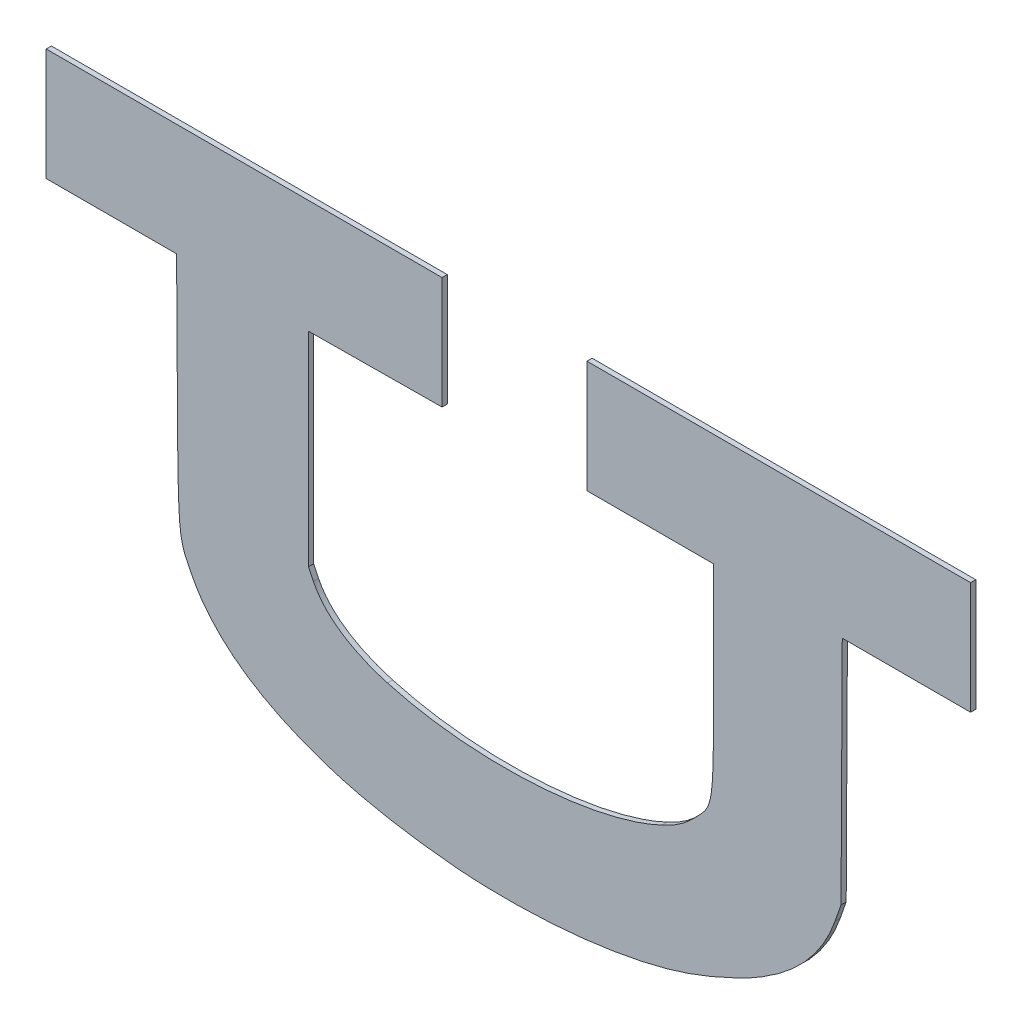
ISO-10303-21;
HEADER;
FILE_DESCRIPTION(('STEP AP214'),'2;1');
FILE_NAME('part.step','',(''),(''),'','','');
FILE_SCHEMA(('AUTOMOTIVE_DESIGN { 1 0 10303 214 1 1 1 1 }'));
ENDSEC;
DATA;
#1=APPLICATION_CONTEXT('core data for automotive mechanical design processes');
#2=APPLICATION_PROTOCOL_DEFINITION('international standard','automotive_design',2000,#1);
#3=PRODUCT_CONTEXT('',#1,'mechanical');
#4=PRODUCT('Part','Part','',(#3));
#5=PRODUCT_RELATED_PRODUCT_CATEGORY('part','',(#4));
#6=PRODUCT_DEFINITION_FORMATION('','',#4);
#7=PRODUCT_DEFINITION_CONTEXT('part definition',#1,'design');
#8=PRODUCT_DEFINITION('design','',#6,#7);
#9=PRODUCT_DEFINITION_SHAPE('','',#8);
#10=(LENGTH_UNIT() NAMED_UNIT(*) SI_UNIT(.MILLI.,.METRE.));
#11=(NAMED_UNIT(*) PLANE_ANGLE_UNIT() SI_UNIT($,.RADIAN.));
#12=(NAMED_UNIT(*) SI_UNIT($,.STERADIAN.) SOLID_ANGLE_UNIT());
#13=UNCERTAINTY_MEASURE_WITH_UNIT(LENGTH_MEASURE(1.E-05),#10,'distance_accuracy_value','');
#14=(GEOMETRIC_REPRESENTATION_CONTEXT(3) GLOBAL_UNCERTAINTY_ASSIGNED_CONTEXT((#13)) GLOBAL_UNIT_ASSIGNED_CONTEXT((#10,
#11,#12)) REPRESENTATION_CONTEXT('',''));
#15=CARTESIAN_POINT('',(0.,0.,0.));
#16=DIRECTION('',(0.,0.,1.));
#17=DIRECTION('',(1.,0.,0.));
#18=AXIS2_PLACEMENT_3D('',#15,#16,#17);
#19=CARTESIAN_POINT('',(-0.3891774209814,-0.131630911380568,0.003));
#20=CARTESIAN_POINT('',(-0.3891774209814,-0.131630911380568,-0.00024));
#21=CARTESIAN_POINT('',(-0.4147421679216,-0.129393168332968,0.003));
#22=CARTESIAN_POINT('',(-0.4147421679216,-0.129393168332968,-0.00024));
#23=CARTESIAN_POINT('',(-0.438749026182,-0.124840020720268,0.003));
#24=CARTESIAN_POINT('',(-0.438749026182,-0.124840020720268,-0.00024));
#25=CARTESIAN_POINT('',(-0.4567901889816,-0.118806779040868,0.003));
#26=CARTESIAN_POINT('',(-0.4567901889816,-0.118806779040868,-0.00024));
#27=B_SPLINE_SURFACE_WITH_KNOTS('',3,1,((#19,#20),(#21,#22),(#23,#24),(#25,#26)),.UNSPECIFIED.,
.F.,.F.,.F.,(4,4),(2,2),(0.,1.),(0.,0.00036),.UNSPECIFIED.);
#28=DIRECTION('',(0.,0.,1.));
#29=VECTOR('',#28,1.);
#30=CARTESIAN_POINT('',(-0.3891774542553,-0.131629746790468,0.0003));
#31=LINE('',#30,#29);
#32=CARTESIAN_POINT('',(-0.389177433699558,-0.13163032942896,0.0003));
#33=VERTEX_POINT('',#32);
#34=CARTESIAN_POINT('',(-0.389177441496779,-0.13163032874638,0.003));
#35=VERTEX_POINT('',#34);
#36=EDGE_CURVE('E11',#33,#35,#31,.T.);
#37=CARTESIAN_POINT('',(-0.3891774209814,-0.131630911380568,0.003));
#38=CARTESIAN_POINT('',(-0.4147421679216,-0.129393168332968,0.003));
#39=CARTESIAN_POINT('',(-0.438749026182,-0.124840020720268,0.003));
#40=CARTESIAN_POINT('',(-0.4567901889816,-0.118806779040868,0.003));
#41=B_SPLINE_CURVE_WITH_KNOTS('',3,(#37,#38,#39,#40),.UNSPECIFIED.,.F.,.F.,(4,4),(0.,1.),.UNSPECIFIED.);
#42=CARTESIAN_POINT('',(-0.4567901889816,-0.118806779040868,0.003));
#43=VERTEX_POINT('',#42);
#44=EDGE_CURVE('E27',#35,#43,#41,.T.);
#45=DIRECTION('',(0.,0.,1.));
#46=VECTOR('',#45,1.);
#47=CARTESIAN_POINT('',(-0.4567901889816,-0.118806779040868,0.0003));
#48=LINE('',#47,#46);
#49=CARTESIAN_POINT('',(-0.4567901889816,-0.118806779040868,0.0003));
#50=VERTEX_POINT('',#49);
#51=EDGE_CURVE('E492',#50,#43,#48,.T.);
#52=CARTESIAN_POINT('',(-0.4567901889816,-0.118806779040868,0.0003));
#53=CARTESIAN_POINT('',(-0.438749026182,-0.124840020720268,0.0003));
#54=CARTESIAN_POINT('',(-0.4147421679216,-0.129393168332968,0.0003));
#55=CARTESIAN_POINT('',(-0.3891774209814,-0.131630911380568,0.0003));
#56=B_SPLINE_CURVE_WITH_KNOTS('',3,(#52,#53,#54,#55),.UNSPECIFIED.,.F.,.F.,(4,4),(0.,1.),.UNSPECIFIED.);
#57=EDGE_CURVE('E512',#33,#50,#56,.F.);
#58=ORIENTED_EDGE('',*,*,#36,.T.);
#59=ORIENTED_EDGE('',*,*,#44,.T.);
#60=ORIENTED_EDGE('',*,*,#51,.F.);
#61=ORIENTED_EDGE('',*,*,#57,.F.);
#62=EDGE_LOOP('',(#58,#59,#60,#61));
#63=FACE_BOUND('',#62,.T.);
#64=ADVANCED_FACE('F17',(#63),#27,.T.);
#65=CARTESIAN_POINT('',(-0.4567901889816,-0.118806779040868,0.003));
#66=CARTESIAN_POINT('',(-0.4567901889816,-0.118806779040868,-0.00024));
#67=CARTESIAN_POINT('',(-0.4916580135813,-0.107146903960468,0.003));
#68=CARTESIAN_POINT('',(-0.4916580135813,-0.107146903960468,-0.00024));
#69=CARTESIAN_POINT('',(-0.5145305611815,-0.09065664230068,0.003));
#70=CARTESIAN_POINT('',(-0.5145305611815,-0.09065664230068,-0.00024));
#71=CARTESIAN_POINT('',(-0.5258803225815,-0.068992273640683,0.003));
#72=CARTESIAN_POINT('',(-0.5258803225815,-0.068992273640683,-0.00024));
#73=B_SPLINE_SURFACE_WITH_KNOTS('',3,1,((#65,#66),(#67,#68),(#69,#70),(#71,#72)),.UNSPECIFIED.,
.F.,.F.,.F.,(4,4),(2,2),(0.,1.),(0.,0.00036),.UNSPECIFIED.);
#74=CARTESIAN_POINT('',(-0.4567901889816,-0.118806779040868,0.003));
#75=CARTESIAN_POINT('',(-0.4916580135813,-0.107146903960468,0.003));
#76=CARTESIAN_POINT('',(-0.5145305611815,-0.09065664230068,0.003));
#77=CARTESIAN_POINT('',(-0.5258803225815,-0.068992273640683,0.003));
#78=B_SPLINE_CURVE_WITH_KNOTS('',3,(#74,#75,#76,#77),.UNSPECIFIED.,.F.,.F.,(4,4),(0.,1.),.UNSPECIFIED.);
#79=CARTESIAN_POINT('',(-0.5258803225815,-0.068992273640683,0.003));
#80=VERTEX_POINT('',#79);
#81=EDGE_CURVE('E489',#43,#80,#78,.T.);
#82=DIRECTION('',(0.,0.,1.));
#83=VECTOR('',#82,1.);
#84=CARTESIAN_POINT('',(-0.5258803225815,-0.068992273640683,0.0003));
#85=LINE('',#84,#83);
#86=CARTESIAN_POINT('',(-0.5258803225815,-0.068992273640683,0.0003));
#87=VERTEX_POINT('',#86);
#88=EDGE_CURVE('E522',#87,#80,#85,.T.);
#89=CARTESIAN_POINT('',(-0.4567901889816,-0.118806779040868,0.0003));
#90=CARTESIAN_POINT('',(-0.4916580135813,-0.107146903960468,0.0003));
#91=CARTESIAN_POINT('',(-0.5145305611815,-0.09065664230068,0.0003));
#92=CARTESIAN_POINT('',(-0.5258803225815,-0.068992273640683,0.0003));
#93=B_SPLINE_CURVE_WITH_KNOTS('',3,(#89,#90,#91,#92),.UNSPECIFIED.,.F.,.F.,(4,4),(0.,1.),.UNSPECIFIED.);
#94=EDGE_CURVE('E517',#50,#87,#93,.T.);
#95=ORIENTED_EDGE('',*,*,#51,.T.);
#96=ORIENTED_EDGE('',*,*,#81,.T.);
#97=ORIENTED_EDGE('',*,*,#88,.F.);
#98=ORIENTED_EDGE('',*,*,#94,.F.);
#99=EDGE_LOOP('',(#95,#96,#97,#98));
#100=FACE_BOUND('',#99,.T.);
#101=ADVANCED_FACE('F520',(#100),#73,.T.);
#102=CARTESIAN_POINT('',(-0.5258803225815,-0.068992273640683,0.003));
#103=CARTESIAN_POINT('',(-0.5258803225815,-0.068992273640683,-0.00024));
#104=CARTESIAN_POINT('',(-0.5333806149219,-0.054674804180683,0.003));
#105=CARTESIAN_POINT('',(-0.5333806149219,-0.054674804180683,-0.00024));
#106=CARTESIAN_POINT('',(-0.5332591648215,-0.055927903020679,0.003));
#107=CARTESIAN_POINT('',(-0.5332591648215,-0.055927903020679,-0.00024));
#108=CARTESIAN_POINT('',(-0.5337086965614,0.01173377775932,0.003));
#109=CARTESIAN_POINT('',(-0.5337086965614,0.01173377775932,-0.00024));
#110=B_SPLINE_SURFACE_WITH_KNOTS('',3,1,((#102,#103),(#104,#105),(#106,#107),(#108,#109)),
.UNSPECIFIED.,.F.,.F.,.F.,(4,4),(2,2),(0.,1.),(0.,0.00036),.UNSPECIFIED.);
#111=CARTESIAN_POINT('',(-0.5258803225815,-0.068992273640683,0.003));
#112=CARTESIAN_POINT('',(-0.5333806149219,-0.054674804180683,0.003));
#113=CARTESIAN_POINT('',(-0.5332591648215,-0.055927903020679,0.003));
#114=CARTESIAN_POINT('',(-0.5337086965614,0.01173377775932,0.003));
#115=B_SPLINE_CURVE_WITH_KNOTS('',3,(#111,#112,#113,#114),.UNSPECIFIED.,.F.,.F.,(4,4),(0.,1.),.UNSPECIFIED.);
#116=CARTESIAN_POINT('',(-0.5337086965614,0.01173377775932,0.003));
#117=VERTEX_POINT('',#116);
#118=EDGE_CURVE('E523',#80,#117,#115,.T.);
#119=DIRECTION('',(0.,0.,1.));
#120=VECTOR('',#119,1.);
#121=CARTESIAN_POINT('',(-0.5337086965614,0.01173377775932,0.0003));
#122=LINE('',#121,#120);
#123=CARTESIAN_POINT('',(-0.5337086965614,0.01173377775932,0.0003));
#124=VERTEX_POINT('',#123);
#125=EDGE_CURVE('E526',#124,#117,#122,.T.);
#126=CARTESIAN_POINT('',(-0.5258803225815,-0.068992273640683,0.0003));
#127=CARTESIAN_POINT('',(-0.5333806149219,-0.054674804180683,0.0003));
#128=CARTESIAN_POINT('',(-0.5332591648215,-0.055927903020679,0.0003));
#129=CARTESIAN_POINT('',(-0.5337086965614,0.01173377775932,0.0003));
#130=B_SPLINE_CURVE_WITH_KNOTS('',3,(#126,#127,#128,#129),.UNSPECIFIED.,.F.,.F.,(4,4),(0.,1.),.UNSPECIFIED.);
#131=EDGE_CURVE('E551',#87,#124,#130,.T.);
#132=ORIENTED_EDGE('',*,*,#88,.T.);
#133=ORIENTED_EDGE('',*,*,#118,.T.);
#134=ORIENTED_EDGE('',*,*,#125,.F.);
#135=ORIENTED_EDGE('',*,*,#131,.F.);
#136=EDGE_LOOP('',(#132,#133,#134,#135));
#137=FACE_BOUND('',#136,.T.);
#138=ADVANCED_FACE('F549',(#137),#110,.T.);
#139=CARTESIAN_POINT('',(-0.5339112187626,0.0422127617593175,0.003));
#140=DIRECTION('',(-0.99997792503977,-0.006644503981185,0.));
#141=DIRECTION('',(0.,0.,1.));
#142=AXIS2_PLACEMENT_3D('',#139,#140,#141);
#143=PLANE('',#142);
#144=ORIENTED_EDGE('',*,*,#125,.T.);
#145=DIRECTION('',(-0.006644503981185,0.99997792503977,0.));
#146=VECTOR('',#145,1.);
#147=CARTESIAN_POINT('',(-0.5337086965614,0.01173377775932,0.003));
#148=LINE('',#147,#146);
#149=CARTESIAN_POINT('',(-0.5341137409638,0.072691745759315,0.003));
#150=VERTEX_POINT('',#149);
#151=EDGE_CURVE('E554',#117,#150,#148,.T.);
#152=ORIENTED_EDGE('',*,*,#151,.T.);
#153=DIRECTION('',(0.,0.,1.));
#154=VECTOR('',#153,1.);
#155=CARTESIAN_POINT('',(-0.5341137409638,0.072691745759315,0.0003));
#156=LINE('',#155,#154);
#157=CARTESIAN_POINT('',(-0.5341137409638,0.072691745759315,0.0003));
#158=VERTEX_POINT('',#157);
#159=EDGE_CURVE('E559',#158,#150,#156,.T.);
#160=ORIENTED_EDGE('',*,*,#159,.F.);
#161=DIRECTION('',(-0.006644503981185,0.99997792503977,0.));
#162=VECTOR('',#161,1.);
#163=CARTESIAN_POINT('',(-0.5337086965614,0.01173377775932,0.0003));
#164=LINE('',#163,#162);
#165=EDGE_CURVE('E562',#124,#158,#164,.T.);
#166=ORIENTED_EDGE('',*,*,#165,.F.);
#167=EDGE_LOOP('',(#144,#152,#160,#166));
#168=FACE_BOUND('',#167,.T.);
#169=ADVANCED_FACE('F577',(#168),#143,.T.);
#170=CARTESIAN_POINT('',(-0.56812309636365,0.072691745759315,0.003));
#171=DIRECTION('',(0.,-1.,0.));
#172=DIRECTION('',(0.,0.,-1.));
#173=AXIS2_PLACEMENT_3D('',#170,#171,#172);
#174=PLANE('',#173);
#175=ORIENTED_EDGE('',*,*,#159,.T.);
#176=DIRECTION('',(-1.,0.,0.));
#177=VECTOR('',#176,1.);
#178=CARTESIAN_POINT('',(-0.5341137409638,0.072691745759315,0.003));
#179=LINE('',#178,#177);
#180=CARTESIAN_POINT('',(-0.6021324517635,0.072691745759315,0.003));
#181=VERTEX_POINT('',#180);
#182=EDGE_CURVE('E556',#150,#181,#179,.T.);
#183=ORIENTED_EDGE('',*,*,#182,.T.);
#184=DIRECTION('',(0.,0.,1.));
#185=VECTOR('',#184,1.);
#186=CARTESIAN_POINT('',(-0.6021324517635,0.072691745759315,0.0003));
#187=LINE('',#186,#185);
#188=CARTESIAN_POINT('',(-0.6021324517635,0.072691745759315,0.0003));
#189=VERTEX_POINT('',#188);
#190=EDGE_CURVE('E587',#189,#181,#187,.T.);
#191=ORIENTED_EDGE('',*,*,#190,.F.);
#192=DIRECTION('',(-1.,0.,0.));
#193=VECTOR('',#192,1.);
#194=CARTESIAN_POINT('',(-0.5341137409638,0.072691745759315,0.0003));
#195=LINE('',#194,#193);
#196=EDGE_CURVE('E582',#158,#189,#195,.T.);
#197=ORIENTED_EDGE('',*,*,#196,.F.);
#198=EDGE_LOOP('',(#175,#183,#191,#197));
#199=FACE_BOUND('',#198,.T.);
#200=ADVANCED_FACE('F585',(#199),#174,.T.);
#201=CARTESIAN_POINT('',(-0.6021324517635,0.101972865759123,0.003));
#202=DIRECTION('',(-1.,0.,0.));
#203=DIRECTION('',(0.,0.,1.));
#204=AXIS2_PLACEMENT_3D('',#201,#202,#203);
#205=PLANE('',#204);
#206=ORIENTED_EDGE('',*,*,#190,.T.);
#207=DIRECTION('',(0.,1.,0.));
#208=VECTOR('',#207,1.);
#209=CARTESIAN_POINT('',(-0.6021324517635,0.072691745759315,0.003));
#210=LINE('',#209,#208);
#211=CARTESIAN_POINT('',(-0.6021324517635,0.131253985758932,0.003));
#212=VERTEX_POINT('',#211);
#213=EDGE_CURVE('E588',#181,#212,#210,.T.);
#214=ORIENTED_EDGE('',*,*,#213,.T.);
#215=DIRECTION('',(0.,0.,1.));
#216=VECTOR('',#215,1.);
#217=CARTESIAN_POINT('',(-0.6021324517635,0.131253985758932,0.0003));
#218=LINE('',#217,#216);
#219=CARTESIAN_POINT('',(-0.6021324517635,0.131253985758932,0.0003));
#220=VERTEX_POINT('',#219);
#221=EDGE_CURVE('E591',#220,#212,#218,.T.);
#222=ORIENTED_EDGE('',*,*,#221,.F.);
#223=DIRECTION('',(0.,1.,0.));
#224=VECTOR('',#223,1.);
#225=CARTESIAN_POINT('',(-0.6021324517635,0.072691745759315,0.0003));
#226=LINE('',#225,#224);
#227=EDGE_CURVE('E598',#189,#220,#226,.T.);
#228=ORIENTED_EDGE('',*,*,#227,.F.);
#229=EDGE_LOOP('',(#206,#214,#222,#228));
#230=FACE_BOUND('',#229,.T.);
#231=ADVANCED_FACE('F596',(#230),#205,.T.);
#232=CARTESIAN_POINT('',(-0.4988499557634,0.131253985758932,0.003));
#233=DIRECTION('',(0.,1.,0.));
#234=DIRECTION('',(0.,0.,1.));
#235=AXIS2_PLACEMENT_3D('',#232,#233,#234);
#236=PLANE('',#235);
#237=ORIENTED_EDGE('',*,*,#221,.T.);
#238=DIRECTION('',(1.,0.,0.));
#239=VECTOR('',#238,1.);
#240=CARTESIAN_POINT('',(-0.6021324517635,0.131253985758932,0.003));
#241=LINE('',#240,#239);
#242=CARTESIAN_POINT('',(-0.3955674597633,0.131253985758932,0.003));
#243=VERTEX_POINT('',#242);
#244=EDGE_CURVE('E601',#212,#243,#241,.T.);
#245=ORIENTED_EDGE('',*,*,#244,.T.);
#246=DIRECTION('',(0.,0.,1.));
#247=VECTOR('',#246,1.);
#248=CARTESIAN_POINT('',(-0.3955674597633,0.131253985758932,0.0003));
#249=LINE('',#248,#247);
#250=CARTESIAN_POINT('',(-0.3955674597633,0.131253985758932,0.0003));
#251=VERTEX_POINT('',#250);
#252=EDGE_CURVE('E606',#251,#243,#249,.T.);
#253=ORIENTED_EDGE('',*,*,#252,.F.);
#254=DIRECTION('',(1.,0.,0.));
#255=VECTOR('',#254,1.);
#256=CARTESIAN_POINT('',(-0.6021324517635,0.131253985758932,0.0003));
#257=LINE('',#256,#255);
#258=EDGE_CURVE('E609',#220,#251,#257,.T.);
#259=ORIENTED_EDGE('',*,*,#258,.F.);
#260=EDGE_LOOP('',(#237,#245,#253,#259));
#261=FACE_BOUND('',#260,.T.);
#262=ADVANCED_FACE('F613',(#261),#236,.T.);
#263=CARTESIAN_POINT('',(-0.3955674597633,0.101987839059123,0.003));
#264=DIRECTION('',(1.,0.,0.));
#265=DIRECTION('',(0.,0.,-1.));
#266=AXIS2_PLACEMENT_3D('',#263,#264,#265);
#267=PLANE('',#266);
#268=ORIENTED_EDGE('',*,*,#252,.T.);
#269=DIRECTION('',(0.,-1.,0.));
#270=VECTOR('',#269,1.);
#271=CARTESIAN_POINT('',(-0.3955674597633,0.131253985758932,0.003));
#272=LINE('',#271,#270);
#273=CARTESIAN_POINT('',(-0.3955674597633,0.072721692359315,0.003));
#274=VERTEX_POINT('',#273);
#275=EDGE_CURVE('E603',#243,#274,#272,.T.);
#276=ORIENTED_EDGE('',*,*,#275,.T.);
#277=DIRECTION('',(0.,0.,1.));
#278=VECTOR('',#277,1.);
#279=CARTESIAN_POINT('',(-0.3955674597633,0.072721692359315,0.0003));
#280=LINE('',#279,#278);
#281=CARTESIAN_POINT('',(-0.3955674597633,0.072721692359315,0.0003));
#282=VERTEX_POINT('',#281);
#283=EDGE_CURVE('E623',#282,#274,#280,.T.);
#284=ORIENTED_EDGE('',*,*,#283,.F.);
#285=DIRECTION('',(0.,-1.,0.));
#286=VECTOR('',#285,1.);
#287=CARTESIAN_POINT('',(-0.3955674597633,0.131253985758932,0.0003));
#288=LINE('',#287,#286);
#289=EDGE_CURVE('E618',#251,#282,#288,.T.);
#290=ORIENTED_EDGE('',*,*,#289,.F.);
#291=EDGE_LOOP('',(#268,#276,#284,#290));
#292=FACE_BOUND('',#291,.T.);
#293=ADVANCED_FACE('F621',(#292),#267,.T.);
#294=CARTESIAN_POINT('',(-0.43043861176335,0.072440942984315,0.003));
#295=DIRECTION('',(0.008050788698891,-0.99996759187552,0.));
#296=DIRECTION('',(0.,0.,-1.));
#297=AXIS2_PLACEMENT_3D('',#294,#295,#296);
#298=PLANE('',#297);
#299=ORIENTED_EDGE('',*,*,#283,.T.);
#300=DIRECTION('',(-0.99996759187552,-0.008050788698891,0.));
#301=VECTOR('',#300,1.);
#302=CARTESIAN_POINT('',(-0.3955674597633,0.072721692359315,0.003));
#303=LINE('',#302,#301);
#304=CARTESIAN_POINT('',(-0.4653097637634,0.072160193609315,0.003));
#305=VERTEX_POINT('',#304);
#306=EDGE_CURVE('E624',#274,#305,#303,.T.);
#307=ORIENTED_EDGE('',*,*,#306,.T.);
#308=DIRECTION('',(0.,0.,1.));
#309=VECTOR('',#308,1.);
#310=CARTESIAN_POINT('',(-0.4653097637634,0.072160193609315,0.0003));
#311=LINE('',#310,#309);
#312=CARTESIAN_POINT('',(-0.4653097637634,0.072160193609315,0.0003));
#313=VERTEX_POINT('',#312);
#314=EDGE_CURVE('E627',#313,#305,#311,.T.);
#315=ORIENTED_EDGE('',*,*,#314,.F.);
#316=DIRECTION('',(-0.99996759187552,-0.008050788698891,0.));
#317=VECTOR('',#316,1.);
#318=CARTESIAN_POINT('',(-0.3955674597633,0.072721692359315,0.0003));
#319=LINE('',#318,#317);
#320=EDGE_CURVE('E634',#282,#313,#319,.T.);
#321=ORIENTED_EDGE('',*,*,#320,.F.);
#322=EDGE_LOOP('',(#299,#307,#315,#321));
#323=FACE_BOUND('',#322,.T.);
#324=ADVANCED_FACE('F632',(#323),#298,.T.);
#325=CARTESIAN_POINT('',(-0.4653097637634,0.0189217936093175,0.003));
#326=DIRECTION('',(1.,0.,0.));
#327=DIRECTION('',(0.,0.,-1.));
#328=AXIS2_PLACEMENT_3D('',#325,#326,#327);
#329=PLANE('',#328);
#330=ORIENTED_EDGE('',*,*,#314,.T.);
#331=DIRECTION('',(0.,-1.,0.));
#332=VECTOR('',#331,1.);
#333=CARTESIAN_POINT('',(-0.4653097637634,0.072160193609315,0.003));
#334=LINE('',#333,#332);
#335=CARTESIAN_POINT('',(-0.4653097637634,-0.03431660639068,0.003));
#336=VERTEX_POINT('',#335);
#337=EDGE_CURVE('E636',#305,#336,#334,.T.);
#338=ORIENTED_EDGE('',*,*,#337,.T.);
#339=DIRECTION('',(0.,0.,1.));
#340=VECTOR('',#339,1.);
#341=CARTESIAN_POINT('',(-0.4653097637634,-0.03431660639068,0.0003));
#342=LINE('',#341,#340);
#343=CARTESIAN_POINT('',(-0.4653097637634,-0.03431660639068,0.0003));
#344=VERTEX_POINT('',#343);
#345=EDGE_CURVE('E640',#344,#336,#342,.T.);
#346=ORIENTED_EDGE('',*,*,#345,.F.);
#347=DIRECTION('',(0.,-1.,0.));
#348=VECTOR('',#347,1.);
#349=CARTESIAN_POINT('',(-0.4653097637634,0.072160193609315,0.0003));
#350=LINE('',#349,#348);
#351=EDGE_CURVE('E643',#313,#344,#350,.T.);
#352=ORIENTED_EDGE('',*,*,#351,.F.);
#353=EDGE_LOOP('',(#330,#338,#346,#352));
#354=FACE_BOUND('',#353,.T.);
#355=ADVANCED_FACE('F647',(#354),#329,.T.);
#356=CARTESIAN_POINT('',(-0.4640085507195,-0.036978526390681,0.003));
#357=DIRECTION('',(0.89840700790208,0.439163805603822,0.));
#358=DIRECTION('',(0.,0.,-1.));
#359=AXIS2_PLACEMENT_3D('',#356,#357,#358);
#360=PLANE('',#359);
#361=ORIENTED_EDGE('',*,*,#345,.T.);
#362=DIRECTION('',(0.439163805603822,-0.89840700790208,0.));
#363=VECTOR('',#362,1.);
#364=CARTESIAN_POINT('',(-0.4653097637634,-0.03431660639068,0.003));
#365=LINE('',#364,#363);
#366=CARTESIAN_POINT('',(-0.4627073376756,-0.039640446390682,0.003));
#367=VERTEX_POINT('',#366);
#368=EDGE_CURVE('E637',#336,#367,#365,.T.);
#369=ORIENTED_EDGE('',*,*,#368,.T.);
#370=DIRECTION('',(0.,0.,1.));
#371=VECTOR('',#370,1.);
#372=CARTESIAN_POINT('',(-0.4627073376756,-0.039640446390682,0.0003));
#373=LINE('',#372,#371);
#374=CARTESIAN_POINT('',(-0.4627073376756,-0.039640446390682,0.0003));
#375=VERTEX_POINT('',#374);
#376=EDGE_CURVE('E653',#375,#367,#373,.T.);
#377=ORIENTED_EDGE('',*,*,#376,.F.);
#378=DIRECTION('',(0.439163805603822,-0.89840700790208,0.));
#379=VECTOR('',#378,1.);
#380=CARTESIAN_POINT('',(-0.4653097637634,-0.03431660639068,0.0003));
#381=LINE('',#380,#379);
#382=EDGE_CURVE('E650',#344,#375,#381,.T.);
#383=ORIENTED_EDGE('',*,*,#382,.F.);
#384=EDGE_LOOP('',(#361,#369,#377,#383));
#385=FACE_BOUND('',#384,.T.);
#386=ADVANCED_FACE('F297',(#385),#360,.T.);
#387=CARTESIAN_POINT('',(-0.4627073376756,-0.039640446390682,0.003));
#388=CARTESIAN_POINT('',(-0.4627073376756,-0.039640446390682,-0.00024));
#389=CARTESIAN_POINT('',(-0.456956259516,-0.051405800050684,0.003));
#390=CARTESIAN_POINT('',(-0.456956259516,-0.051405800050684,-0.00024));
#391=CARTESIAN_POINT('',(-0.4434626542959,-0.060674605490683,0.003));
#392=CARTESIAN_POINT('',(-0.4434626542959,-0.060674605490683,-0.00024));
#393=CARTESIAN_POINT('',(-0.4240362948759,-0.066205077030685,0.003));
#394=CARTESIAN_POINT('',(-0.4240362948759,-0.066205077030685,-0.00024));
#395=B_SPLINE_SURFACE_WITH_KNOTS('',3,1,((#387,#388),(#389,#390),(#391,#392),(#393,#394)),
.UNSPECIFIED.,.F.,.F.,.F.,(4,4),(2,2),(0.,1.),(0.,0.00036),.UNSPECIFIED.);
#396=CARTESIAN_POINT('',(-0.4627073376756,-0.039640446390682,0.003));
#397=CARTESIAN_POINT('',(-0.456956259516,-0.051405800050684,0.003));
#398=CARTESIAN_POINT('',(-0.4434626542959,-0.060674605490683,0.003));
#399=CARTESIAN_POINT('',(-0.4240362948759,-0.066205077030685,0.003));
#400=B_SPLINE_CURVE_WITH_KNOTS('',3,(#396,#397,#398,#399),.UNSPECIFIED.,.F.,.F.,(4,4),(0.,1.),.UNSPECIFIED.);
#401=CARTESIAN_POINT('',(-0.4240362948759,-0.066205077030685,0.003));
#402=VERTEX_POINT('',#401);
#403=EDGE_CURVE('E265',#367,#402,#400,.T.);
#404=DIRECTION('',(0.,0.,1.));
#405=VECTOR('',#404,1.);
#406=CARTESIAN_POINT('',(-0.4240362948759,-0.066205077030685,0.0003));
#407=LINE('',#406,#405);
#408=CARTESIAN_POINT('',(-0.4240362948759,-0.066205077030685,0.0003));
#409=VERTEX_POINT('',#408);
#410=EDGE_CURVE('E262',#409,#402,#407,.T.);
#411=CARTESIAN_POINT('',(-0.4240362948759,-0.066205077030685,0.0003));
#412=CARTESIAN_POINT('',(-0.4434626542959,-0.060674605490683,0.0003));
#413=CARTESIAN_POINT('',(-0.456956259516,-0.051405800050684,0.0003));
#414=CARTESIAN_POINT('',(-0.4627073376756,-0.039640446390682,0.0003));
#415=B_SPLINE_CURVE_WITH_KNOTS('',3,(#411,#412,#413,#414),.UNSPECIFIED.,.F.,.F.,(4,4),(0.,1.),.UNSPECIFIED.);
#416=EDGE_CURVE('E258',#375,#409,#415,.F.);
#417=ORIENTED_EDGE('',*,*,#376,.T.);
#418=ORIENTED_EDGE('',*,*,#403,.T.);
#419=ORIENTED_EDGE('',*,*,#410,.F.);
#420=ORIENTED_EDGE('',*,*,#416,.F.);
#421=EDGE_LOOP('',(#417,#418,#419,#420));
#422=FACE_BOUND('',#421,.T.);
#423=ADVANCED_FACE('F284',(#422),#395,.T.);
#424=CARTESIAN_POINT('',(-0.4240362948759,-0.066205077030685,0.003));
#425=CARTESIAN_POINT('',(-0.4240362948759,-0.066205077030685,-0.00024));
#426=CARTESIAN_POINT('',(-0.3793093840755,-0.078936707650681,0.003));
#427=CARTESIAN_POINT('',(-0.3793093840755,-0.078936707650681,-0.00024));
#428=CARTESIAN_POINT('',(-0.3164614528761,-0.075689497990684,0.003));
#429=CARTESIAN_POINT('',(-0.3164614528761,-0.075689497990684,-0.00024));
#430=CARTESIAN_POINT('',(-0.2808183440754,-0.058805937650683,0.003));
#431=CARTESIAN_POINT('',(-0.2808183440754,-0.058805937650683,-0.00024));
#432=B_SPLINE_SURFACE_WITH_KNOTS('',3,1,((#424,#425),(#426,#427),(#428,#429),(#430,#431)),
.UNSPECIFIED.,.F.,.F.,.F.,(4,4),(2,2),(0.,1.),(0.,0.00036),.UNSPECIFIED.);
#433=CARTESIAN_POINT('',(-0.4240362948759,-0.066205077030685,0.003));
#434=CARTESIAN_POINT('',(-0.3793093840755,-0.078936707650681,0.003));
#435=CARTESIAN_POINT('',(-0.3164614528761,-0.075689497990684,0.003));
#436=CARTESIAN_POINT('',(-0.2808183440754,-0.058805937650683,0.003));
#437=B_SPLINE_CURVE_WITH_KNOTS('',3,(#433,#434,#435,#436),.UNSPECIFIED.,.F.,.F.,(4,4),(0.,
0.015507645560473),.UNSPECIFIED.);
#438=CARTESIAN_POINT('',(-0.2808183440754,-0.058805937650683,0.003));
#439=VERTEX_POINT('',#438);
#440=EDGE_CURVE('E312',#402,#439,#437,.T.);
#441=DIRECTION('',(0.,0.,1.));
#442=VECTOR('',#441,1.);
#443=CARTESIAN_POINT('',(-0.2808183440754,-0.058805937650683,0.0003));
#444=LINE('',#443,#442);
#445=CARTESIAN_POINT('',(-0.2808183440754,-0.058805937650683,0.0003));
#446=VERTEX_POINT('',#445);
#447=EDGE_CURVE('E319',#446,#439,#444,.T.);
#448=CARTESIAN_POINT('',(-0.4240362948759,-0.066205077030685,0.0003));
#449=CARTESIAN_POINT('',(-0.3793093840755,-0.078936707650681,0.0003));
#450=CARTESIAN_POINT('',(-0.3164614528761,-0.075689497990684,0.0003));
#451=CARTESIAN_POINT('',(-0.2808183440754,-0.058805937650683,0.0003));
#452=B_SPLINE_CURVE_WITH_KNOTS('',3,(#448,#449,#450,#451),.UNSPECIFIED.,.F.,.F.,(4,4),(0.,
0.015507645560473),.UNSPECIFIED.);
#453=EDGE_CURVE('E329',#409,#446,#452,.T.);
#454=ORIENTED_EDGE('',*,*,#410,.T.);
#455=ORIENTED_EDGE('',*,*,#440,.T.);
#456=ORIENTED_EDGE('',*,*,#447,.F.);
#457=ORIENTED_EDGE('',*,*,#453,.F.);
#458=EDGE_LOOP('',(#454,#455,#456,#457));
#459=FACE_BOUND('',#458,.T.);
#460=ADVANCED_FACE('F296',(#459),#432,.T.);
#461=CARTESIAN_POINT('',(-0.2808183440754,-0.058805937650683,0.003));
#462=CARTESIAN_POINT('',(-0.2808183440754,-0.058805937650683,-0.00024));
#463=CARTESIAN_POINT('',(-0.2731779681957,-0.055186724670679,0.003));
#464=CARTESIAN_POINT('',(-0.2731779681957,-0.055186724670679,-0.00024));
#465=CARTESIAN_POINT('',(-0.2693042091153,-0.052526801110681,0.003));
#466=CARTESIAN_POINT('',(-0.2693042091153,-0.052526801110681,-0.00024));
#467=CARTESIAN_POINT('',(-0.2641101377157,-0.047332729710685,0.003));
#468=CARTESIAN_POINT('',(-0.2641101377157,-0.047332729710685,-0.00024));
#469=B_SPLINE_SURFACE_WITH_KNOTS('',3,1,((#461,#462),(#463,#464),(#465,#466),(#467,#468)),
.UNSPECIFIED.,.F.,.F.,.F.,(4,4),(2,2),(0.,1.),(0.,0.00036),.UNSPECIFIED.);
#470=CARTESIAN_POINT('',(-0.2808183440754,-0.058805937650683,0.003));
#471=CARTESIAN_POINT('',(-0.2731779681957,-0.055186724670679,0.003));
#472=CARTESIAN_POINT('',(-0.2693042091153,-0.052526801110681,0.003));
#473=CARTESIAN_POINT('',(-0.2641101377157,-0.047332729710685,0.003));
#474=B_SPLINE_CURVE_WITH_KNOTS('',3,(#470,#471,#472,#473),.UNSPECIFIED.,.F.,.F.,(4,4),(0.,1.),.UNSPECIFIED.);
#475=CARTESIAN_POINT('',(-0.2641101377157,-0.047332729710685,0.003));
#476=VERTEX_POINT('',#475);
#477=EDGE_CURVE('E331',#439,#476,#474,.T.);
#478=DIRECTION('',(0.,0.,1.));
#479=VECTOR('',#478,1.);
#480=CARTESIAN_POINT('',(-0.2641101377157,-0.047332729710685,0.0003));
#481=LINE('',#480,#479);
#482=CARTESIAN_POINT('',(-0.2641101377157,-0.047332729710685,0.0003));
#483=VERTEX_POINT('',#482);
#484=EDGE_CURVE('E342',#483,#476,#481,.T.);
#485=CARTESIAN_POINT('',(-0.2808183440754,-0.058805937650683,0.0003));
#486=CARTESIAN_POINT('',(-0.2731779681957,-0.055186724670679,0.0003));
#487=CARTESIAN_POINT('',(-0.2693042091153,-0.052526801110681,0.0003));
#488=CARTESIAN_POINT('',(-0.2641101377157,-0.047332729710685,0.0003));
#489=B_SPLINE_CURVE_WITH_KNOTS('',3,(#485,#486,#487,#488),.UNSPECIFIED.,.F.,.F.,(4,4),(0.,1.),.UNSPECIFIED.);
#490=EDGE_CURVE('E348',#446,#483,#489,.T.);
#491=ORIENTED_EDGE('',*,*,#447,.T.);
#492=ORIENTED_EDGE('',*,*,#477,.T.);
#493=ORIENTED_EDGE('',*,*,#484,.F.);
#494=ORIENTED_EDGE('',*,*,#490,.F.);
#495=EDGE_LOOP('',(#491,#492,#493,#494));
#496=FACE_BOUND('',#495,.T.);
#497=ADVANCED_FACE('F667',(#496),#469,.T.);
#498=CARTESIAN_POINT('',(-0.2641101377157,-0.047332729710685,0.003));
#499=CARTESIAN_POINT('',(-0.2641101377157,-0.047332729710685,-0.00024));
#500=CARTESIAN_POINT('',(-0.2536880554359,-0.036910647430687,0.003));
#501=CARTESIAN_POINT('',(-0.2536880554359,-0.036910647430687,-0.00024));
#502=CARTESIAN_POINT('',(-0.2539535819553,-0.038717092890685,0.003));
#503=CARTESIAN_POINT('',(-0.2539535819553,-0.038717092890685,-0.00024));
#504=CARTESIAN_POINT('',(-0.2539535819553,0.021777368289317,0.003));
#505=CARTESIAN_POINT('',(-0.2539535819553,0.021777368289317,-0.00024));
#506=B_SPLINE_SURFACE_WITH_KNOTS('',3,1,((#498,#499),(#500,#501),(#502,#503),(#504,#505)),
.UNSPECIFIED.,.F.,.F.,.F.,(4,4),(2,2),(0.,1.),(0.,0.00036),.UNSPECIFIED.);
#507=CARTESIAN_POINT('',(-0.2641101377157,-0.047332729710685,0.003));
#508=CARTESIAN_POINT('',(-0.2536880554359,-0.036910647430687,0.003));
#509=CARTESIAN_POINT('',(-0.2539535819553,-0.038717092890685,0.003));
#510=CARTESIAN_POINT('',(-0.2539535819553,0.021777368289317,0.003));
#511=B_SPLINE_CURVE_WITH_KNOTS('',3,(#507,#508,#509,#510),.UNSPECIFIED.,.F.,.F.,(4,4),(0.,1.),.UNSPECIFIED.);
#512=CARTESIAN_POINT('',(-0.2539535819553,0.021777368289317,0.003));
#513=VERTEX_POINT('',#512);
#514=EDGE_CURVE('E353',#476,#513,#511,.T.);
#515=DIRECTION('',(0.,0.,1.));
#516=VECTOR('',#515,1.);
#517=CARTESIAN_POINT('',(-0.2539535819553,0.021777368289317,0.0003));
#518=LINE('',#517,#516);
#519=CARTESIAN_POINT('',(-0.2539535819553,0.021777368289317,0.0003));
#520=VERTEX_POINT('',#519);
#521=EDGE_CURVE('E360',#520,#513,#518,.T.);
#522=CARTESIAN_POINT('',(-0.2641101377157,-0.047332729710685,0.0003));
#523=CARTESIAN_POINT('',(-0.2536880554359,-0.036910647430687,0.0003));
#524=CARTESIAN_POINT('',(-0.2539535819553,-0.038717092890685,0.0003));
#525=CARTESIAN_POINT('',(-0.2539535819553,0.021777368289317,0.0003));
#526=B_SPLINE_CURVE_WITH_KNOTS('',3,(#522,#523,#524,#525),.UNSPECIFIED.,.F.,.F.,(4,4),(0.,1.),.UNSPECIFIED.);
#527=EDGE_CURVE('E366',#483,#520,#526,.T.);
#528=ORIENTED_EDGE('',*,*,#484,.T.);
#529=ORIENTED_EDGE('',*,*,#514,.T.);
#530=ORIENTED_EDGE('',*,*,#521,.F.);
#531=ORIENTED_EDGE('',*,*,#527,.F.);
#532=EDGE_LOOP('',(#528,#529,#530,#531));
#533=FACE_BOUND('',#532,.T.);
#534=ADVANCED_FACE('F671',(#533),#506,.T.);
#535=CARTESIAN_POINT('',(-0.2539535819553,0.047235305689316,0.003));
#536=DIRECTION('',(-1.,0.,0.));
#537=DIRECTION('',(0.,0.,1.));
#538=AXIS2_PLACEMENT_3D('',#535,#536,#537);
#539=PLANE('',#538);
#540=ORIENTED_EDGE('',*,*,#521,.T.);
#541=DIRECTION('',(0.,1.,0.));
#542=VECTOR('',#541,1.);
#543=CARTESIAN_POINT('',(-0.2539535819553,0.021777368289317,0.003));
#544=LINE('',#543,#542);
#545=CARTESIAN_POINT('',(-0.2539535819553,0.072693243089315,0.003));
#546=VERTEX_POINT('',#545);
#547=EDGE_CURVE('E371',#513,#546,#544,.T.);
#548=ORIENTED_EDGE('',*,*,#547,.T.);
#549=DIRECTION('',(0.,0.,1.));
#550=VECTOR('',#549,1.);
#551=CARTESIAN_POINT('',(-0.2539535819553,0.072693243089315,0.0003));
#552=LINE('',#551,#550);
#553=CARTESIAN_POINT('',(-0.2539535819553,0.072693243089315,0.0003));
#554=VERTEX_POINT('',#553);
#555=EDGE_CURVE('E376',#554,#546,#552,.T.);
#556=ORIENTED_EDGE('',*,*,#555,.F.);
#557=DIRECTION('',(0.,1.,0.));
#558=VECTOR('',#557,1.);
#559=CARTESIAN_POINT('',(-0.2539535819553,0.021777368289317,0.0003));
#560=LINE('',#559,#558);
#561=EDGE_CURVE('E379',#520,#554,#560,.T.);
#562=ORIENTED_EDGE('',*,*,#561,.F.);
#563=EDGE_LOOP('',(#540,#548,#556,#562));
#564=FACE_BOUND('',#563,.T.);
#565=ADVANCED_FACE('F675',(#564),#539,.T.);
#566=CARTESIAN_POINT('',(-0.28696138995555,0.072693243089315,0.003));
#567=DIRECTION('',(0.,-1.,0.));
#568=DIRECTION('',(0.,0.,-1.));
#569=AXIS2_PLACEMENT_3D('',#566,#567,#568);
#570=PLANE('',#569);
#571=ORIENTED_EDGE('',*,*,#555,.T.);
#572=DIRECTION('',(-1.,0.,0.));
#573=VECTOR('',#572,1.);
#574=CARTESIAN_POINT('',(-0.2539535819553,0.072693243089315,0.003));
#575=LINE('',#574,#573);
#576=CARTESIAN_POINT('',(-0.3199691979558,0.072693243089315,0.003));
#577=VERTEX_POINT('',#576);
#578=EDGE_CURVE('E382',#546,#577,#575,.T.);
#579=ORIENTED_EDGE('',*,*,#578,.T.);
#580=DIRECTION('',(0.,0.,1.));
#581=VECTOR('',#580,1.);
#582=CARTESIAN_POINT('',(-0.3199691979558,0.072693243089315,0.0003));
#583=LINE('',#582,#581);
#584=CARTESIAN_POINT('',(-0.3199691979558,0.072693243089315,0.0003));
#585=VERTEX_POINT('',#584);
#586=EDGE_CURVE('E384',#585,#577,#583,.T.);
#587=ORIENTED_EDGE('',*,*,#586,.F.);
#588=DIRECTION('',(-1.,0.,0.));
#589=VECTOR('',#588,1.);
#590=CARTESIAN_POINT('',(-0.2539535819553,0.072693243089315,0.0003));
#591=LINE('',#590,#589);
#592=EDGE_CURVE('E387',#554,#585,#591,.T.);
#593=ORIENTED_EDGE('',*,*,#592,.F.);
#594=EDGE_LOOP('',(#571,#579,#587,#593));
#595=FACE_BOUND('',#594,.T.);
#596=ADVANCED_FACE('F678',(#595),#570,.T.);
#597=CARTESIAN_POINT('',(-0.3199691979558,0.101974363089123,0.003));
#598=DIRECTION('',(-1.,0.,0.));
#599=DIRECTION('',(0.,0.,1.));
#600=AXIS2_PLACEMENT_3D('',#597,#598,#599);
#601=PLANE('',#600);
#602=ORIENTED_EDGE('',*,*,#586,.T.);
#603=DIRECTION('',(0.,1.,0.));
#604=VECTOR('',#603,1.);
#605=CARTESIAN_POINT('',(-0.3199691979558,0.072693243089315,0.003));
#606=LINE('',#605,#604);
#607=CARTESIAN_POINT('',(-0.3199691979558,0.131255483088932,0.003));
#608=VERTEX_POINT('',#607);
#609=EDGE_CURVE('E390',#577,#608,#606,.T.);
#610=ORIENTED_EDGE('',*,*,#609,.T.);
#611=DIRECTION('',(0.,0.,1.));
#612=VECTOR('',#611,1.);
#613=CARTESIAN_POINT('',(-0.3199691979558,0.131255483088932,0.0003));
#614=LINE('',#613,#612);
#615=CARTESIAN_POINT('',(-0.3199691979558,0.131255483088932,0.0003));
#616=VERTEX_POINT('',#615);
#617=EDGE_CURVE('E392',#616,#608,#614,.T.);
#618=ORIENTED_EDGE('',*,*,#617,.F.);
#619=DIRECTION('',(0.,1.,0.));
#620=VECTOR('',#619,1.);
#621=CARTESIAN_POINT('',(-0.3199691979558,0.072693243089315,0.0003));
#622=LINE('',#621,#620);
#623=EDGE_CURVE('E395',#585,#616,#622,.T.);
#624=ORIENTED_EDGE('',*,*,#623,.F.);
#625=EDGE_LOOP('',(#602,#610,#618,#624));
#626=FACE_BOUND('',#625,.T.);
#627=ADVANCED_FACE('F683',(#626),#601,.T.);
#628=CARTESIAN_POINT('',(-0.219881005955774,0.131255483088932,0.003));
#629=DIRECTION('',(0.,1.,0.));
#630=DIRECTION('',(0.,0.,1.));
#631=AXIS2_PLACEMENT_3D('',#628,#629,#630);
#632=PLANE('',#631);
#633=ORIENTED_EDGE('',*,*,#617,.T.);
#634=DIRECTION('',(1.,0.,0.));
#635=VECTOR('',#634,1.);
#636=CARTESIAN_POINT('',(-0.3199691979558,0.131255483088932,0.003));
#637=LINE('',#636,#635);
#638=CARTESIAN_POINT('',(-0.119792813955748,0.131255483088932,0.003));
#639=VERTEX_POINT('',#638);
#640=EDGE_CURVE('E398',#608,#639,#637,.T.);
#641=ORIENTED_EDGE('',*,*,#640,.T.);
#642=DIRECTION('',(0.,0.,1.));
#643=VECTOR('',#642,1.);
#644=CARTESIAN_POINT('',(-0.119792813955748,0.131255483088932,0.0003));
#645=LINE('',#644,#643);
#646=CARTESIAN_POINT('',(-0.119792813955748,0.131255483088932,0.0003));
#647=VERTEX_POINT('',#646);
#648=EDGE_CURVE('E400',#647,#639,#645,.T.);
#649=ORIENTED_EDGE('',*,*,#648,.F.);
#650=DIRECTION('',(1.,0.,0.));
#651=VECTOR('',#650,1.);
#652=CARTESIAN_POINT('',(-0.3199691979558,0.131255483088932,0.0003));
#653=LINE('',#652,#651);
#654=EDGE_CURVE('E403',#616,#647,#653,.T.);
#655=ORIENTED_EDGE('',*,*,#654,.F.);
#656=EDGE_LOOP('',(#633,#641,#649,#655));
#657=FACE_BOUND('',#656,.T.);
#658=ADVANCED_FACE('F687',(#657),#632,.T.);
#659=CARTESIAN_POINT('',(-0.119792813955748,0.101974363089123,0.003));
#660=DIRECTION('',(1.,0.,0.));
#661=DIRECTION('',(0.,0.,-1.));
#662=AXIS2_PLACEMENT_3D('',#659,#660,#661);
#663=PLANE('',#662);
#664=ORIENTED_EDGE('',*,*,#648,.T.);
#665=DIRECTION('',(0.,-1.,0.));
#666=VECTOR('',#665,1.);
#667=CARTESIAN_POINT('',(-0.119792813955748,0.131255483088932,0.003));
#668=LINE('',#667,#666);
#669=CARTESIAN_POINT('',(-0.119792813955748,0.072693243089315,0.003));
#670=VERTEX_POINT('',#669);
#671=EDGE_CURVE('E406',#639,#670,#668,.T.);
#672=ORIENTED_EDGE('',*,*,#671,.T.);
#673=DIRECTION('',(0.,0.,1.));
#674=VECTOR('',#673,1.);
#675=CARTESIAN_POINT('',(-0.119792813955748,0.072693243089315,0.0003));
#676=LINE('',#675,#674);
#677=CARTESIAN_POINT('',(-0.119792813955748,0.072693243089315,0.0003));
#678=VERTEX_POINT('',#677);
#679=EDGE_CURVE('E408',#678,#670,#676,.T.);
#680=ORIENTED_EDGE('',*,*,#679,.F.);
#681=DIRECTION('',(0.,-1.,0.));
#682=VECTOR('',#681,1.);
#683=CARTESIAN_POINT('',(-0.119792813955748,0.131255483088932,0.0003));
#684=LINE('',#683,#682);
#685=EDGE_CURVE('E411',#647,#678,#684,.T.);
#686=ORIENTED_EDGE('',*,*,#685,.F.);
#687=EDGE_LOOP('',(#664,#672,#680,#686));
#688=FACE_BOUND('',#687,.T.);
#689=ADVANCED_FACE('F691',(#688),#663,.T.);
#690=CARTESIAN_POINT('',(-0.153276440155748,0.072693243089315,0.003));
#691=DIRECTION('',(0.,-1.,0.));
#692=DIRECTION('',(0.,0.,-1.));
#693=AXIS2_PLACEMENT_3D('',#690,#691,#692);
#694=PLANE('',#693);
#695=ORIENTED_EDGE('',*,*,#679,.T.);
#696=DIRECTION('',(-1.,0.,0.));
#697=VECTOR('',#696,1.);
#698=CARTESIAN_POINT('',(-0.119792813955748,0.072693243089315,0.003));
#699=LINE('',#698,#697);
#700=CARTESIAN_POINT('',(-0.186760066355748,0.072693243089315,0.003));
#701=VERTEX_POINT('',#700);
#702=EDGE_CURVE('E414',#670,#701,#699,.T.);
#703=ORIENTED_EDGE('',*,*,#702,.T.);
#704=DIRECTION('',(0.,0.,1.));
#705=VECTOR('',#704,1.);
#706=CARTESIAN_POINT('',(-0.186760066355748,0.072693243089315,0.0003));
#707=LINE('',#706,#705);
#708=CARTESIAN_POINT('',(-0.186760066355748,0.072693243089315,0.0003));
#709=VERTEX_POINT('',#708);
#710=EDGE_CURVE('E416',#709,#701,#707,.T.);
#711=ORIENTED_EDGE('',*,*,#710,.F.);
#712=DIRECTION('',(-1.,0.,0.));
#713=VECTOR('',#712,1.);
#714=CARTESIAN_POINT('',(-0.119792813955748,0.072693243089315,0.0003));
#715=LINE('',#714,#713);
#716=EDGE_CURVE('E419',#678,#709,#715,.T.);
#717=ORIENTED_EDGE('',*,*,#716,.F.);
#718=EDGE_LOOP('',(#695,#703,#711,#717));
#719=FACE_BOUND('',#718,.T.);
#720=ADVANCED_FACE('F694',(#719),#694,.T.);
#721=CARTESIAN_POINT('',(-0.187083822375747,0.0122676590893175,0.003));
#722=DIRECTION('',(0.99998564660469,-0.005357852610922,0.));
#723=DIRECTION('',(0.,0.,-1.));
#724=AXIS2_PLACEMENT_3D('',#721,#722,#723);
#725=PLANE('',#724);
#726=ORIENTED_EDGE('',*,*,#710,.T.);
#727=DIRECTION('',(-0.005357852610922,-0.99998564660469,0.));
#728=VECTOR('',#727,1.);
#729=CARTESIAN_POINT('',(-0.186760066355748,0.072693243089315,0.003));
#730=LINE('',#729,#728);
#731=CARTESIAN_POINT('',(-0.187407578395746,-0.04815792491068,0.003));
#732=VERTEX_POINT('',#731);
#733=EDGE_CURVE('E422',#701,#732,#730,.T.);
#734=ORIENTED_EDGE('',*,*,#733,.T.);
#735=DIRECTION('',(0.,0.,1.));
#736=VECTOR('',#735,1.);
#737=CARTESIAN_POINT('',(-0.187407578395746,-0.04815792491068,0.0003));
#738=LINE('',#737,#736);
#739=CARTESIAN_POINT('',(-0.187407578395746,-0.04815792491068,0.0003));
#740=VERTEX_POINT('',#739);
#741=EDGE_CURVE('E424',#740,#732,#738,.T.);
#742=ORIENTED_EDGE('',*,*,#741,.F.);
#743=DIRECTION('',(-0.005357852610922,-0.99998564660469,0.));
#744=VECTOR('',#743,1.);
#745=CARTESIAN_POINT('',(-0.186760066355748,0.072693243089315,0.0003));
#746=LINE('',#745,#744);
#747=EDGE_CURVE('E427',#709,#740,#746,.T.);
#748=ORIENTED_EDGE('',*,*,#747,.F.);
#749=EDGE_LOOP('',(#726,#734,#742,#748));
#750=FACE_BOUND('',#749,.T.);
#751=ADVANCED_FACE('F698',(#750),#725,.T.);
#752=CARTESIAN_POINT('',(-0.188959644125748,-0.0526044959006815,0.003));
#753=DIRECTION('',(0.944138337081903,-0.329549390004321,0.));
#754=DIRECTION('',(0.,0.,-1.));
#755=AXIS2_PLACEMENT_3D('',#752,#753,#754);
#756=PLANE('',#755);
#757=ORIENTED_EDGE('',*,*,#741,.T.);
#758=DIRECTION('',(-0.329549390004321,-0.944138337081903,0.));
#759=VECTOR('',#758,1.);
#760=CARTESIAN_POINT('',(-0.187407578395746,-0.04815792491068,0.003));
#761=LINE('',#760,#759);
#762=CARTESIAN_POINT('',(-0.19051170985575,-0.057051066890683,0.003));
#763=VERTEX_POINT('',#762);
#764=EDGE_CURVE('E430',#732,#763,#761,.T.);
#765=ORIENTED_EDGE('',*,*,#764,.T.);
#766=DIRECTION('',(0.,0.,1.));
#767=VECTOR('',#766,1.);
#768=CARTESIAN_POINT('',(-0.19051170985575,-0.057051066890683,0.0003));
#769=LINE('',#768,#767);
#770=CARTESIAN_POINT('',(-0.19051170985575,-0.057051066890683,0.0003));
#771=VERTEX_POINT('',#770);
#772=EDGE_CURVE('E432',#771,#763,#769,.T.);
#773=ORIENTED_EDGE('',*,*,#772,.F.);
#774=DIRECTION('',(-0.329549390004321,-0.944138337081903,0.));
#775=VECTOR('',#774,1.);
#776=CARTESIAN_POINT('',(-0.187407578395746,-0.04815792491068,0.0003));
#777=LINE('',#776,#775);
#778=EDGE_CURVE('E435',#740,#771,#777,.T.);
#779=ORIENTED_EDGE('',*,*,#778,.F.);
#780=EDGE_LOOP('',(#757,#765,#773,#779));
#781=FACE_BOUND('',#780,.T.);
#782=ADVANCED_FACE('F702',(#781),#756,.T.);
#783=CARTESIAN_POINT('',(-0.19051170985575,-0.057051066890683,0.003));
#784=CARTESIAN_POINT('',(-0.19051170985575,-0.057051066890683,-0.00024));
#785=CARTESIAN_POINT('',(-0.198050932775745,-0.078650551250686,0.003));
#786=CARTESIAN_POINT('',(-0.198050932775745,-0.078650551250686,-0.00024));
#787=CARTESIAN_POINT('',(-0.2146922583957,-0.095336131290868,0.003));
#788=CARTESIAN_POINT('',(-0.2146922583957,-0.095336131290868,-0.00024));
#789=CARTESIAN_POINT('',(-0.2416272286554,-0.108299681690968,0.003));
#790=CARTESIAN_POINT('',(-0.2416272286554,-0.108299681690968,-0.00024));
#791=B_SPLINE_SURFACE_WITH_KNOTS('',3,1,((#783,#784),(#785,#786),(#787,#788),(#789,#790)),
.UNSPECIFIED.,.F.,.F.,.F.,(4,4),(2,2),(0.,1.),(0.,0.00036),.UNSPECIFIED.);
#792=CARTESIAN_POINT('',(-0.19051170985575,-0.057051066890683,0.003));
#793=CARTESIAN_POINT('',(-0.198050932775745,-0.078650551250686,0.003));
#794=CARTESIAN_POINT('',(-0.2146922583957,-0.095336131290868,0.003));
#795=CARTESIAN_POINT('',(-0.2416272286554,-0.108299681690968,0.003));
#796=B_SPLINE_CURVE_WITH_KNOTS('',3,(#792,#793,#794,#795),.UNSPECIFIED.,.F.,.F.,(4,4),(0.,1.),.UNSPECIFIED.);
#797=CARTESIAN_POINT('',(-0.2416272286554,-0.108299681690968,0.003));
#798=VERTEX_POINT('',#797);
#799=EDGE_CURVE('E437',#763,#798,#796,.T.);
#800=DIRECTION('',(0.,0.,1.));
#801=VECTOR('',#800,1.);
#802=CARTESIAN_POINT('',(-0.2416272286554,-0.108299681690968,0.0003));
#803=LINE('',#802,#801);
#804=CARTESIAN_POINT('',(-0.2416272286554,-0.108299681690968,0.0003));
#805=VERTEX_POINT('',#804);
#806=EDGE_CURVE('E441',#805,#798,#803,.T.);
#807=CARTESIAN_POINT('',(-0.19051170985575,-0.057051066890683,0.0003));
#808=CARTESIAN_POINT('',(-0.198050932775745,-0.078650551250686,0.0003));
#809=CARTESIAN_POINT('',(-0.2146922583957,-0.095336131290868,0.0003));
#810=CARTESIAN_POINT('',(-0.2416272286554,-0.108299681690968,0.0003));
#811=B_SPLINE_CURVE_WITH_KNOTS('',3,(#807,#808,#809,#810),.UNSPECIFIED.,.F.,.F.,(4,4),(0.,1.),.UNSPECIFIED.);
#812=EDGE_CURVE('E207',#771,#805,#811,.T.);
#813=ORIENTED_EDGE('',*,*,#772,.T.);
#814=ORIENTED_EDGE('',*,*,#799,.T.);
#815=ORIENTED_EDGE('',*,*,#806,.F.);
#816=ORIENTED_EDGE('',*,*,#812,.F.);
#817=EDGE_LOOP('',(#813,#814,#815,#816));
#818=FACE_BOUND('',#817,.T.);
#819=ADVANCED_FACE('F704',(#818),#791,.T.);
#820=CARTESIAN_POINT('',(-0.2416272286554,-0.108299681690968,0.003));
#821=CARTESIAN_POINT('',(-0.2416272286554,-0.108299681690968,-0.00024));
#822=CARTESIAN_POINT('',(-0.2637750685356,-0.118959007590568,0.003));
#823=CARTESIAN_POINT('',(-0.2637750685356,-0.118959007590568,-0.00024));
#824=CARTESIAN_POINT('',(-0.2805478264557,-0.124189014911068,0.003));
#825=CARTESIAN_POINT('',(-0.2805478264557,-0.124189014911068,-0.00024));
#826=CARTESIAN_POINT('',(-0.3061255502556,-0.128409489070768,0.003));
#827=CARTESIAN_POINT('',(-0.3061255502556,-0.128409489070768,-0.00024));
#828=B_SPLINE_SURFACE_WITH_KNOTS('',3,1,((#820,#821),(#822,#823),(#824,#825),(#826,#827)),
.UNSPECIFIED.,.F.,.F.,.F.,(4,4),(2,2),(0.,1.),(0.,0.00036),.UNSPECIFIED.);
#829=CARTESIAN_POINT('',(-0.2416272286554,-0.108299681690968,0.003));
#830=CARTESIAN_POINT('',(-0.2637750685356,-0.118959007590568,0.003));
#831=CARTESIAN_POINT('',(-0.2805478264557,-0.124189014911068,0.003));
#832=CARTESIAN_POINT('',(-0.3061255502556,-0.128409489070768,0.003));
#833=B_SPLINE_CURVE_WITH_KNOTS('',3,(#829,#830,#831,#832),.UNSPECIFIED.,.F.,.F.,(4,4),(0.,1.),.UNSPECIFIED.);
#834=CARTESIAN_POINT('',(-0.3061255502556,-0.128409489070768,0.003));
#835=VERTEX_POINT('',#834);
#836=EDGE_CURVE('E195',#798,#835,#833,.T.);
#837=DIRECTION('',(0.,0.,1.));
#838=VECTOR('',#837,1.);
#839=CARTESIAN_POINT('',(-0.3061255502556,-0.128409489070768,0.0003));
#840=LINE('',#839,#838);
#841=CARTESIAN_POINT('',(-0.3061255502556,-0.128409489070768,0.0003));
#842=VERTEX_POINT('',#841);
#843=EDGE_CURVE('E189',#842,#835,#840,.T.);
#844=CARTESIAN_POINT('',(-0.2416272286554,-0.108299681690968,0.0003));
#845=CARTESIAN_POINT('',(-0.2637750685356,-0.118959007590568,0.0003));
#846=CARTESIAN_POINT('',(-0.2805478264557,-0.124189014911068,0.0003));
#847=CARTESIAN_POINT('',(-0.3061255502556,-0.128409489070768,0.0003));
#848=B_SPLINE_CURVE_WITH_KNOTS('',3,(#844,#845,#846,#847),.UNSPECIFIED.,.F.,.F.,(4,4),(0.,1.),.UNSPECIFIED.);
#849=EDGE_CURVE('E193',#805,#842,#848,.T.);
#850=ORIENTED_EDGE('',*,*,#806,.T.);
#851=ORIENTED_EDGE('',*,*,#836,.T.);
#852=ORIENTED_EDGE('',*,*,#843,.F.);
#853=ORIENTED_EDGE('',*,*,#849,.F.);
#854=EDGE_LOOP('',(#850,#851,#852,#853));
#855=FACE_BOUND('',#854,.T.);
#856=ADVANCED_FACE('F192',(#855),#828,.T.);
#857=CARTESIAN_POINT('',(-0.3061255502556,-0.128409489070768,0.003));
#858=CARTESIAN_POINT('',(-0.3061255502556,-0.128409489070768,-0.00024));
#859=CARTESIAN_POINT('',(-0.332057974896,-0.132688858210768,0.003));
#860=CARTESIAN_POINT('',(-0.332057974896,-0.132688858210768,-0.00024));
#861=CARTESIAN_POINT('',(-0.3632570082558,-0.133898368110868,0.003));
#862=CARTESIAN_POINT('',(-0.3632570082558,-0.133898368110868,-0.00024));
#863=CARTESIAN_POINT('',(-0.3891774542553,-0.131629746790468,0.003));
#864=CARTESIAN_POINT('',(-0.3891774542553,-0.131629746790468,-0.00024));
#865=B_SPLINE_SURFACE_WITH_KNOTS('',3,1,((#857,#858),(#859,#860),(#861,#862),(#863,#864)),
.UNSPECIFIED.,.F.,.F.,.F.,(4,4),(2,2),(0.,1.),(0.,0.00036),.UNSPECIFIED.);
#866=CARTESIAN_POINT('',(-0.3061255502556,-0.128409489070768,0.003));
#867=CARTESIAN_POINT('',(-0.332057974896,-0.132688858210768,0.003));
#868=CARTESIAN_POINT('',(-0.3632570082558,-0.133898368110868,0.003));
#869=CARTESIAN_POINT('',(-0.3891774542553,-0.131629746790468,0.003));
#870=B_SPLINE_CURVE_WITH_KNOTS('',3,(#866,#867,#868,#869),.UNSPECIFIED.,.F.,.F.,(4,4),(0.,1.),.UNSPECIFIED.);
#871=EDGE_CURVE('E208',#835,#35,#870,.T.);
#872=CARTESIAN_POINT('',(-0.3891774542553,-0.131629746790468,0.0003));
#873=CARTESIAN_POINT('',(-0.3632570082558,-0.133898368110868,0.0003));
#874=CARTESIAN_POINT('',(-0.332057974896,-0.132688858210768,0.0003));
#875=CARTESIAN_POINT('',(-0.3061255502556,-0.128409489070768,0.0003));
#876=B_SPLINE_CURVE_WITH_KNOTS('',3,(#872,#873,#874,#875),.UNSPECIFIED.,.F.,.F.,(4,4),(0.,1.),.UNSPECIFIED.);
#877=EDGE_CURVE('E203',#842,#33,#876,.F.);
#878=ORIENTED_EDGE('',*,*,#843,.T.);
#879=ORIENTED_EDGE('',*,*,#871,.T.);
#880=ORIENTED_EDGE('',*,*,#36,.F.);
#881=ORIENTED_EDGE('',*,*,#877,.F.);
#882=EDGE_LOOP('',(#878,#879,#880,#881));
#883=FACE_BOUND('',#882,.T.);
#884=ADVANCED_FACE('F211',(#883),#865,.T.);
#885=CARTESIAN_POINT('',(-0.360962632859624,-0.133898368110868,0.0003));
#886=DIRECTION('',(0.,0.,1.));
#887=DIRECTION('',(1.,0.,0.));
#888=AXIS2_PLACEMENT_3D('',#885,#886,#887);
#889=PLANE('',#888);
#890=ORIENTED_EDGE('',*,*,#57,.T.);
#891=ORIENTED_EDGE('',*,*,#94,.T.);
#892=ORIENTED_EDGE('',*,*,#131,.T.);
#893=ORIENTED_EDGE('',*,*,#165,.T.);
#894=ORIENTED_EDGE('',*,*,#196,.T.);
#895=ORIENTED_EDGE('',*,*,#227,.T.);
#896=ORIENTED_EDGE('',*,*,#258,.T.);
#897=ORIENTED_EDGE('',*,*,#289,.T.);
#898=ORIENTED_EDGE('',*,*,#320,.T.);
#899=ORIENTED_EDGE('',*,*,#351,.T.);
#900=ORIENTED_EDGE('',*,*,#382,.T.);
#901=ORIENTED_EDGE('',*,*,#416,.T.);
#902=ORIENTED_EDGE('',*,*,#453,.T.);
#903=ORIENTED_EDGE('',*,*,#490,.T.);
#904=ORIENTED_EDGE('',*,*,#527,.T.);
#905=ORIENTED_EDGE('',*,*,#561,.T.);
#906=ORIENTED_EDGE('',*,*,#592,.T.);
#907=ORIENTED_EDGE('',*,*,#623,.T.);
#908=ORIENTED_EDGE('',*,*,#654,.T.);
#909=ORIENTED_EDGE('',*,*,#685,.T.);
#910=ORIENTED_EDGE('',*,*,#716,.T.);
#911=ORIENTED_EDGE('',*,*,#747,.T.);
#912=ORIENTED_EDGE('',*,*,#778,.T.);
#913=ORIENTED_EDGE('',*,*,#812,.T.);
#914=ORIENTED_EDGE('',*,*,#849,.T.);
#915=ORIENTED_EDGE('',*,*,#877,.T.);
#916=EDGE_LOOP('',(#890,#891,#892,#893,#894,#895,#896,#897,#898,#899,#900,#901,#902,#903,#904,
#905,#906,#907,#908,#909,#910,#911,#912,#913,#914,#915));
#917=FACE_BOUND('',#916,.T.);
#918=ADVANCED_FACE('F202',(#917),#889,.F.);
#919=CARTESIAN_POINT('',(-0.360962632859624,-0.133898368110868,0.003));
#920=DIRECTION('',(0.,0.,1.));
#921=DIRECTION('',(1.,0.,0.));
#922=AXIS2_PLACEMENT_3D('',#919,#920,#921);
#923=PLANE('',#922);
#924=ORIENTED_EDGE('',*,*,#871,.F.);
#925=ORIENTED_EDGE('',*,*,#836,.F.);
#926=ORIENTED_EDGE('',*,*,#799,.F.);
#927=ORIENTED_EDGE('',*,*,#764,.F.);
#928=ORIENTED_EDGE('',*,*,#733,.F.);
#929=ORIENTED_EDGE('',*,*,#702,.F.);
#930=ORIENTED_EDGE('',*,*,#671,.F.);
#931=ORIENTED_EDGE('',*,*,#640,.F.);
#932=ORIENTED_EDGE('',*,*,#609,.F.);
#933=ORIENTED_EDGE('',*,*,#578,.F.);
#934=ORIENTED_EDGE('',*,*,#547,.F.);
#935=ORIENTED_EDGE('',*,*,#514,.F.);
#936=ORIENTED_EDGE('',*,*,#477,.F.);
#937=ORIENTED_EDGE('',*,*,#440,.F.);
#938=ORIENTED_EDGE('',*,*,#403,.F.);
#939=ORIENTED_EDGE('',*,*,#368,.F.);
#940=ORIENTED_EDGE('',*,*,#337,.F.);
#941=ORIENTED_EDGE('',*,*,#306,.F.);
#942=ORIENTED_EDGE('',*,*,#275,.F.);
#943=ORIENTED_EDGE('',*,*,#244,.F.);
#944=ORIENTED_EDGE('',*,*,#213,.F.);
#945=ORIENTED_EDGE('',*,*,#182,.F.);
#946=ORIENTED_EDGE('',*,*,#151,.F.);
#947=ORIENTED_EDGE('',*,*,#118,.F.);
#948=ORIENTED_EDGE('',*,*,#81,.F.);
#949=ORIENTED_EDGE('',*,*,#44,.F.);
#950=EDGE_LOOP('',(#924,#925,#926,#927,#928,#929,#930,#931,#932,#933,#934,#935,#936,#937,#938,
#939,#940,#941,#942,#943,#944,#945,#946,#947,#948,#949));
#951=FACE_BOUND('',#950,.T.);
#952=ADVANCED_FACE('F229',(#951),#923,.T.);
#953=CLOSED_SHELL('',(#64,#101,#138,#169,#200,#231,#262,#293,#324,#355,#386,#423,#460,#497,#534,
#565,#596,#627,#658,#689,#720,#751,#782,#819,#856,#884,#918,#952));
#954=MANIFOLD_SOLID_BREP('B1',#953);
#955=ADVANCED_BREP_SHAPE_REPRESENTATION('',(#18,#954),#14);
#956=SHAPE_DEFINITION_REPRESENTATION(#9,#955);
ENDSEC;
END-ISO-10303-21;
